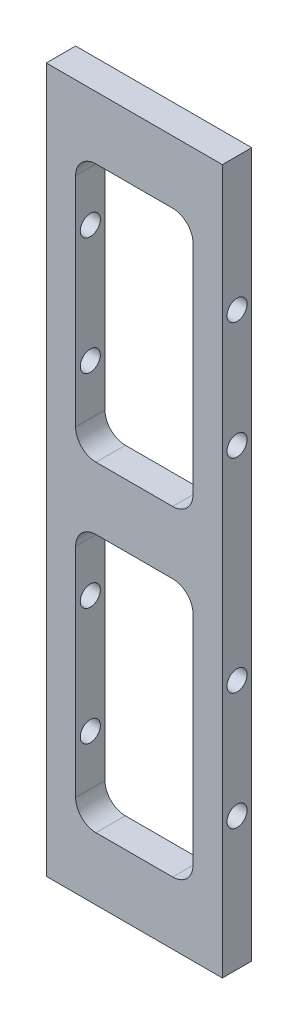
ISO-10303-21;
HEADER;
FILE_DESCRIPTION(('STEP AP214'),'2;1');
FILE_NAME('part.step','',(''),(''),'','','');
FILE_SCHEMA(('AUTOMOTIVE_DESIGN { 1 0 10303 214 1 1 1 1 }'));
ENDSEC;
DATA;
#1=APPLICATION_CONTEXT('core data for automotive mechanical design processes');
#2=APPLICATION_PROTOCOL_DEFINITION('international standard','automotive_design',2000,#1);
#3=PRODUCT_CONTEXT('',#1,'mechanical');
#4=PRODUCT('Part','Part','',(#3));
#5=PRODUCT_RELATED_PRODUCT_CATEGORY('part','',(#4));
#6=PRODUCT_DEFINITION_FORMATION('','',#4);
#7=PRODUCT_DEFINITION_CONTEXT('part definition',#1,'design');
#8=PRODUCT_DEFINITION('design','',#6,#7);
#9=PRODUCT_DEFINITION_SHAPE('','',#8);
#10=(LENGTH_UNIT() NAMED_UNIT(*) SI_UNIT(.MILLI.,.METRE.));
#11=(NAMED_UNIT(*) PLANE_ANGLE_UNIT() SI_UNIT($,.RADIAN.));
#12=(NAMED_UNIT(*) SI_UNIT($,.STERADIAN.) SOLID_ANGLE_UNIT());
#13=UNCERTAINTY_MEASURE_WITH_UNIT(LENGTH_MEASURE(1.E-05),#10,'distance_accuracy_value','');
#14=(GEOMETRIC_REPRESENTATION_CONTEXT(3) GLOBAL_UNCERTAINTY_ASSIGNED_CONTEXT((#13)) GLOBAL_UNIT_ASSIGNED_CONTEXT((#10,
#11,#12)) REPRESENTATION_CONTEXT('',''));
#15=CARTESIAN_POINT('',(0.,0.,0.));
#16=DIRECTION('',(0.,0.,1.));
#17=DIRECTION('',(1.,0.,0.));
#18=AXIS2_PLACEMENT_3D('',#15,#16,#17);
#19=CARTESIAN_POINT('',(14.2875,-57.15,-4.7625));
#20=DIRECTION('',(-1.,0.,0.));
#21=DIRECTION('',(0.,0.,-1.));
#22=AXIS2_PLACEMENT_3D('',#19,#20,#21);
#23=PLANE('',#22);
#24=CARTESIAN_POINT('',(14.2875,35.56,-2.38125));
#25=DIRECTION('',(-1.,0.,0.));
#26=DIRECTION('',(0.,0.,1.));
#27=AXIS2_PLACEMENT_3D('',#24,#25,#26);
#28=CIRCLE('',#27,1.63194999999999);
#29=CARTESIAN_POINT('',(14.2875,35.56,-0.749300000000011));
#30=VERTEX_POINT('',#29);
#31=EDGE_CURVE('E620',#30,#30,#28,.T.);
#32=ORIENTED_EDGE('',*,*,#31,.T.);
#33=EDGE_LOOP('',(#32));
#34=FACE_BOUND('',#33,.T.);
#35=CARTESIAN_POINT('',(14.2875,16.51,-2.38125));
#36=DIRECTION('',(-1.,0.,0.));
#37=DIRECTION('',(0.,0.,1.));
#38=AXIS2_PLACEMENT_3D('',#35,#36,#37);
#39=CIRCLE('',#38,1.63194999999999);
#40=CARTESIAN_POINT('',(14.2875,16.51,-0.749300000000006));
#41=VERTEX_POINT('',#40);
#42=EDGE_CURVE('E315',#41,#41,#39,.T.);
#43=ORIENTED_EDGE('',*,*,#42,.T.);
#44=EDGE_LOOP('',(#43));
#45=FACE_BOUND('',#44,.T.);
#46=CARTESIAN_POINT('',(14.2875,-16.51,-2.38124999999999));
#47=DIRECTION('',(-1.,0.,0.));
#48=DIRECTION('',(0.,0.,1.));
#49=AXIS2_PLACEMENT_3D('',#46,#47,#48);
#50=CIRCLE('',#49,1.63194999999999);
#51=CARTESIAN_POINT('',(14.2875,-16.51,-0.749300000000003));
#52=VERTEX_POINT('',#51);
#53=EDGE_CURVE('E312',#52,#52,#50,.T.);
#54=ORIENTED_EDGE('',*,*,#53,.T.);
#55=EDGE_LOOP('',(#54));
#56=FACE_BOUND('',#55,.T.);
#57=CARTESIAN_POINT('',(14.2875,-35.56,-2.38124999999999));
#58=DIRECTION('',(-1.,0.,0.));
#59=DIRECTION('',(0.,0.,1.));
#60=AXIS2_PLACEMENT_3D('',#57,#58,#59);
#61=CIRCLE('',#60,1.63194999999999);
#62=CARTESIAN_POINT('',(14.2875,-35.56,-0.749300000000003));
#63=VERTEX_POINT('',#62);
#64=EDGE_CURVE('E330',#63,#63,#61,.T.);
#65=ORIENTED_EDGE('',*,*,#64,.T.);
#66=EDGE_LOOP('',(#65));
#67=FACE_BOUND('',#66,.T.);
#68=DIRECTION('',(0.,1.,0.));
#69=VECTOR('',#68,1.);
#70=CARTESIAN_POINT('',(14.2875,-57.15,0.));
#71=LINE('',#70,#69);
#72=CARTESIAN_POINT('',(14.2875,-57.15,0.));
#73=VERTEX_POINT('',#72);
#74=CARTESIAN_POINT('',(14.2875,57.15,0.));
#75=VERTEX_POINT('',#74);
#76=EDGE_CURVE('E214',#73,#75,#71,.T.);
#77=ORIENTED_EDGE('',*,*,#76,.F.);
#78=DIRECTION('',(0.,0.,1.));
#79=VECTOR('',#78,1.);
#80=CARTESIAN_POINT('',(14.2875,-57.15,-4.7625));
#81=LINE('',#80,#79);
#82=CARTESIAN_POINT('',(14.2875,-57.15,-4.7625));
#83=VERTEX_POINT('',#82);
#84=EDGE_CURVE('E202',#83,#73,#81,.T.);
#85=ORIENTED_EDGE('',*,*,#84,.F.);
#86=DIRECTION('',(0.,1.,0.));
#87=VECTOR('',#86,1.);
#88=CARTESIAN_POINT('',(14.2875,-57.15,-4.7625));
#89=LINE('',#88,#87);
#90=CARTESIAN_POINT('',(14.2875,57.15,-4.7625));
#91=VERTEX_POINT('',#90);
#92=EDGE_CURVE('E182',#83,#91,#89,.T.);
#93=ORIENTED_EDGE('',*,*,#92,.T.);
#94=DIRECTION('',(0.,0.,1.));
#95=VECTOR('',#94,1.);
#96=CARTESIAN_POINT('',(14.2875,57.15,-4.7625));
#97=LINE('',#96,#95);
#98=EDGE_CURVE('E191',#91,#75,#97,.T.);
#99=ORIENTED_EDGE('',*,*,#98,.T.);
#100=EDGE_LOOP('',(#77,#85,#93,#99));
#101=FACE_BOUND('',#100,.T.);
#102=ADVANCED_FACE('F39',(#34,#45,#56,#67,#101),#23,.F.);
#103=CARTESIAN_POINT('',(-14.2875,57.15,-4.7625));
#104=DIRECTION('',(0.,-1.,0.));
#105=DIRECTION('',(0.,0.,1.));
#106=AXIS2_PLACEMENT_3D('',#103,#104,#105);
#107=PLANE('',#106);
#108=DIRECTION('',(-1.,0.,0.));
#109=VECTOR('',#108,1.);
#110=CARTESIAN_POINT('',(-14.2875,57.15,0.));
#111=LINE('',#110,#109);
#112=CARTESIAN_POINT('',(-14.2875,57.15,0.));
#113=VERTEX_POINT('',#112);
#114=EDGE_CURVE('E194',#75,#113,#111,.T.);
#115=ORIENTED_EDGE('',*,*,#114,.F.);
#116=ORIENTED_EDGE('',*,*,#98,.F.);
#117=DIRECTION('',(-1.,0.,0.));
#118=VECTOR('',#117,1.);
#119=CARTESIAN_POINT('',(-14.2875,57.15,-4.7625));
#120=LINE('',#119,#118);
#121=CARTESIAN_POINT('',(-14.2875,57.15,-4.7625));
#122=VERTEX_POINT('',#121);
#123=EDGE_CURVE('E178',#91,#122,#120,.T.);
#124=ORIENTED_EDGE('',*,*,#123,.T.);
#125=DIRECTION('',(0.,0.,1.));
#126=VECTOR('',#125,1.);
#127=CARTESIAN_POINT('',(-14.2875,57.15,-4.7625));
#128=LINE('',#127,#126);
#129=EDGE_CURVE('E199',#122,#113,#128,.T.);
#130=ORIENTED_EDGE('',*,*,#129,.T.);
#131=EDGE_LOOP('',(#115,#116,#124,#130));
#132=FACE_BOUND('',#131,.T.);
#133=ADVANCED_FACE('F192',(#132),#107,.F.);
#134=CARTESIAN_POINT('',(-14.2875,-57.15,-4.7625));
#135=DIRECTION('',(1.,0.,0.));
#136=DIRECTION('',(0.,0.,1.));
#137=AXIS2_PLACEMENT_3D('',#134,#135,#136);
#138=PLANE('',#137);
#139=CARTESIAN_POINT('',(-14.2875,35.56,-2.38125));
#140=DIRECTION('',(-1.,0.,0.));
#141=DIRECTION('',(0.,0.,1.));
#142=AXIS2_PLACEMENT_3D('',#139,#140,#141);
#143=CIRCLE('',#142,1.63194999999999);
#144=CARTESIAN_POINT('',(-14.2875,35.56,-0.749300000000004));
#145=VERTEX_POINT('',#144);
#146=EDGE_CURVE('E590',#145,#145,#143,.T.);
#147=ORIENTED_EDGE('',*,*,#146,.F.);
#148=EDGE_LOOP('',(#147));
#149=FACE_BOUND('',#148,.T.);
#150=CARTESIAN_POINT('',(-14.2875,16.51,-2.38125));
#151=DIRECTION('',(-1.,0.,0.));
#152=DIRECTION('',(0.,0.,1.));
#153=AXIS2_PLACEMENT_3D('',#150,#151,#152);
#154=CIRCLE('',#153,1.63194999999999);
#155=CARTESIAN_POINT('',(-14.2875,16.51,-0.749300000000002));
#156=VERTEX_POINT('',#155);
#157=EDGE_CURVE('E308',#156,#156,#154,.T.);
#158=ORIENTED_EDGE('',*,*,#157,.F.);
#159=EDGE_LOOP('',(#158));
#160=FACE_BOUND('',#159,.T.);
#161=CARTESIAN_POINT('',(-14.2875,-16.51,-2.38124999999999));
#162=DIRECTION('',(-1.,0.,0.));
#163=DIRECTION('',(0.,0.,1.));
#164=AXIS2_PLACEMENT_3D('',#161,#162,#163);
#165=CIRCLE('',#164,1.63194999999999);
#166=CARTESIAN_POINT('',(-14.2875,-16.51,-0.749299999999998));
#167=VERTEX_POINT('',#166);
#168=EDGE_CURVE('E304',#167,#167,#165,.T.);
#169=ORIENTED_EDGE('',*,*,#168,.F.);
#170=EDGE_LOOP('',(#169));
#171=FACE_BOUND('',#170,.T.);
#172=CARTESIAN_POINT('',(-14.2875,-35.56,-2.38124999999999));
#173=DIRECTION('',(-1.,0.,0.));
#174=DIRECTION('',(0.,0.,1.));
#175=AXIS2_PLACEMENT_3D('',#172,#173,#174);
#176=CIRCLE('',#175,1.63194999999999);
#177=CARTESIAN_POINT('',(-14.2875,-35.56,-0.749299999999996));
#178=VERTEX_POINT('',#177);
#179=EDGE_CURVE('E300',#178,#178,#176,.T.);
#180=ORIENTED_EDGE('',*,*,#179,.F.);
#181=EDGE_LOOP('',(#180));
#182=FACE_BOUND('',#181,.T.);
#183=DIRECTION('',(0.,-1.,0.));
#184=VECTOR('',#183,1.);
#185=CARTESIAN_POINT('',(-14.2875,-57.15,0.));
#186=LINE('',#185,#184);
#187=CARTESIAN_POINT('',(-14.2875,-57.15,0.));
#188=VERTEX_POINT('',#187);
#189=EDGE_CURVE('E205',#113,#188,#186,.T.);
#190=ORIENTED_EDGE('',*,*,#189,.F.);
#191=ORIENTED_EDGE('',*,*,#129,.F.);
#192=DIRECTION('',(0.,-1.,0.));
#193=VECTOR('',#192,1.);
#194=CARTESIAN_POINT('',(-14.2875,-57.15,-4.7625));
#195=LINE('',#194,#193);
#196=CARTESIAN_POINT('',(-14.2875,-57.15,-4.7625));
#197=VERTEX_POINT('',#196);
#198=EDGE_CURVE('E185',#122,#197,#195,.T.);
#199=ORIENTED_EDGE('',*,*,#198,.T.);
#200=DIRECTION('',(0.,0.,1.));
#201=VECTOR('',#200,1.);
#202=CARTESIAN_POINT('',(-14.2875,-57.15,-4.7625));
#203=LINE('',#202,#201);
#204=EDGE_CURVE('E221',#197,#188,#203,.T.);
#205=ORIENTED_EDGE('',*,*,#204,.T.);
#206=EDGE_LOOP('',(#190,#191,#199,#205));
#207=FACE_BOUND('',#206,.T.);
#208=ADVANCED_FACE('F424',(#149,#160,#171,#182,#207),#138,.F.);
#209=CARTESIAN_POINT('',(-14.2875,-57.15,-4.7625));
#210=DIRECTION('',(0.,1.,0.));
#211=DIRECTION('',(0.,0.,-1.));
#212=AXIS2_PLACEMENT_3D('',#209,#210,#211);
#213=PLANE('',#212);
#214=DIRECTION('',(1.,0.,0.));
#215=VECTOR('',#214,1.);
#216=CARTESIAN_POINT('',(-14.2875,-57.15,0.));
#217=LINE('',#216,#215);
#218=EDGE_CURVE('E203',#188,#73,#217,.T.);
#219=ORIENTED_EDGE('',*,*,#218,.F.);
#220=ORIENTED_EDGE('',*,*,#204,.F.);
#221=DIRECTION('',(1.,0.,0.));
#222=VECTOR('',#221,1.);
#223=CARTESIAN_POINT('',(-14.2875,-57.15,-4.7625));
#224=LINE('',#223,#222);
#225=EDGE_CURVE('E212',#197,#83,#224,.T.);
#226=ORIENTED_EDGE('',*,*,#225,.T.);
#227=ORIENTED_EDGE('',*,*,#84,.T.);
#228=EDGE_LOOP('',(#219,#220,#226,#227));
#229=FACE_BOUND('',#228,.T.);
#230=ADVANCED_FACE('F576',(#229),#213,.F.);
#231=CARTESIAN_POINT('',(0.,0.,-4.7625));
#232=DIRECTION('',(0.,0.,1.));
#233=DIRECTION('',(-1.,0.,0.));
#234=AXIS2_PLACEMENT_3D('',#231,#232,#233);
#235=PLANE('',#234);
#236=DIRECTION('',(1.,0.,0.));
#237=VECTOR('',#236,1.);
#238=CARTESIAN_POINT('',(-9.52500000000001,-46.99,-4.7625));
#239=LINE('',#238,#237);
#240=CARTESIAN_POINT('',(-6.22300000000001,-46.99,-4.7625));
#241=VERTEX_POINT('',#240);
#242=CARTESIAN_POINT('',(6.223,-46.99,-4.7625));
#243=VERTEX_POINT('',#242);
#244=EDGE_CURVE('E354',#241,#243,#239,.T.);
#245=ORIENTED_EDGE('',*,*,#244,.T.);
#246=CARTESIAN_POINT('',(6.223,-43.688,-4.7625));
#247=DIRECTION('',(0.,0.,-1.));
#248=DIRECTION('',(-1.,0.,0.));
#249=AXIS2_PLACEMENT_3D('',#246,#247,#248);
#250=CIRCLE('',#249,3.302);
#251=CARTESIAN_POINT('',(9.525,-43.688,-4.7625));
#252=VERTEX_POINT('',#251);
#253=EDGE_CURVE('E260',#252,#243,#250,.T.);
#254=ORIENTED_EDGE('',*,*,#253,.F.);
#255=DIRECTION('',(0.,1.,0.));
#256=VECTOR('',#255,1.);
#257=CARTESIAN_POINT('',(9.52500000000001,-5.08,-4.7625));
#258=LINE('',#257,#256);
#259=CARTESIAN_POINT('',(9.52500000000001,-8.382,-4.7625));
#260=VERTEX_POINT('',#259);
#261=EDGE_CURVE('E357',#252,#260,#258,.T.);
#262=ORIENTED_EDGE('',*,*,#261,.T.);
#263=CARTESIAN_POINT('',(6.223,-8.382,-4.7625));
#264=DIRECTION('',(0.,0.,-1.));
#265=DIRECTION('',(-1.,0.,0.));
#266=AXIS2_PLACEMENT_3D('',#263,#264,#265);
#267=CIRCLE('',#266,3.302);
#268=CARTESIAN_POINT('',(6.223,-5.08,-4.7625));
#269=VERTEX_POINT('',#268);
#270=EDGE_CURVE('E272',#269,#260,#267,.T.);
#271=ORIENTED_EDGE('',*,*,#270,.F.);
#272=DIRECTION('',(-1.,0.,0.));
#273=VECTOR('',#272,1.);
#274=CARTESIAN_POINT('',(-9.52500000000001,-5.08,-4.7625));
#275=LINE('',#274,#273);
#276=CARTESIAN_POINT('',(-6.22300000000001,-5.08,-4.7625));
#277=VERTEX_POINT('',#276);
#278=EDGE_CURVE('E342',#269,#277,#275,.T.);
#279=ORIENTED_EDGE('',*,*,#278,.T.);
#280=CARTESIAN_POINT('',(-6.22300000000001,-8.382,-4.7625));
#281=DIRECTION('',(0.,0.,-1.));
#282=DIRECTION('',(-1.,0.,0.));
#283=AXIS2_PLACEMENT_3D('',#280,#281,#282);
#284=CIRCLE('',#283,3.302);
#285=CARTESIAN_POINT('',(-9.52500000000001,-8.382,-4.7625));
#286=VERTEX_POINT('',#285);
#287=EDGE_CURVE('E266',#286,#277,#284,.T.);
#288=ORIENTED_EDGE('',*,*,#287,.F.);
#289=DIRECTION('',(0.,-1.,0.));
#290=VECTOR('',#289,1.);
#291=CARTESIAN_POINT('',(-9.52500000000001,-5.08,-4.7625));
#292=LINE('',#291,#290);
#293=CARTESIAN_POINT('',(-9.52500000000001,-43.688,-4.7625));
#294=VERTEX_POINT('',#293);
#295=EDGE_CURVE('E337',#286,#294,#292,.T.);
#296=ORIENTED_EDGE('',*,*,#295,.T.);
#297=CARTESIAN_POINT('',(-6.22300000000001,-43.688,-4.7625));
#298=DIRECTION('',(0.,0.,-1.));
#299=DIRECTION('',(-1.,0.,0.));
#300=AXIS2_PLACEMENT_3D('',#297,#298,#299);
#301=CIRCLE('',#300,3.302);
#302=EDGE_CURVE('E254',#241,#294,#301,.T.);
#303=ORIENTED_EDGE('',*,*,#302,.F.);
#304=EDGE_LOOP('',(#245,#254,#262,#271,#279,#288,#296,#303));
#305=FACE_BOUND('',#304,.T.);
#306=DIRECTION('',(-1.,0.,0.));
#307=VECTOR('',#306,1.);
#308=CARTESIAN_POINT('',(-9.52500000000001,46.99,-4.7625));
#309=LINE('',#308,#307);
#310=CARTESIAN_POINT('',(6.223,46.99,-4.7625));
#311=VERTEX_POINT('',#310);
#312=CARTESIAN_POINT('',(-6.22300000000001,46.99,-4.7625));
#313=VERTEX_POINT('',#312);
#314=EDGE_CURVE('E374',#311,#313,#309,.T.);
#315=ORIENTED_EDGE('',*,*,#314,.T.);
#316=CARTESIAN_POINT('',(-6.22300000000001,43.688,-4.7625));
#317=DIRECTION('',(0.,0.,-1.));
#318=DIRECTION('',(-1.,0.,0.));
#319=AXIS2_PLACEMENT_3D('',#316,#317,#318);
#320=CIRCLE('',#319,3.302);
#321=CARTESIAN_POINT('',(-9.52500000000001,43.688,-4.7625));
#322=VERTEX_POINT('',#321);
#323=EDGE_CURVE('E48',#322,#313,#320,.T.);
#324=ORIENTED_EDGE('',*,*,#323,.F.);
#325=DIRECTION('',(0.,-1.,0.));
#326=VECTOR('',#325,1.);
#327=CARTESIAN_POINT('',(-9.52500000000001,5.08,-4.7625));
#328=LINE('',#327,#326);
#329=CARTESIAN_POINT('',(-9.52500000000001,8.382,-4.7625));
#330=VERTEX_POINT('',#329);
#331=EDGE_CURVE('E376',#322,#330,#328,.T.);
#332=ORIENTED_EDGE('',*,*,#331,.T.);
#333=CARTESIAN_POINT('',(-6.22300000000001,8.382,-4.7625));
#334=DIRECTION('',(0.,0.,-1.));
#335=DIRECTION('',(-1.,0.,0.));
#336=AXIS2_PLACEMENT_3D('',#333,#334,#335);
#337=CIRCLE('',#336,3.302);
#338=CARTESIAN_POINT('',(-6.22300000000001,5.08,-4.7625));
#339=VERTEX_POINT('',#338);
#340=EDGE_CURVE('E278',#339,#330,#337,.T.);
#341=ORIENTED_EDGE('',*,*,#340,.F.);
#342=DIRECTION('',(1.,0.,0.));
#343=VECTOR('',#342,1.);
#344=CARTESIAN_POINT('',(-9.52500000000001,5.08,-4.7625));
#345=LINE('',#344,#343);
#346=CARTESIAN_POINT('',(6.22300000000001,5.08,-4.7625));
#347=VERTEX_POINT('',#346);
#348=EDGE_CURVE('E208',#339,#347,#345,.T.);
#349=ORIENTED_EDGE('',*,*,#348,.T.);
#350=CARTESIAN_POINT('',(6.22300000000001,8.382,-4.7625));
#351=DIRECTION('',(0.,0.,-1.));
#352=DIRECTION('',(-1.,0.,0.));
#353=AXIS2_PLACEMENT_3D('',#350,#351,#352);
#354=CIRCLE('',#353,3.302);
#355=CARTESIAN_POINT('',(9.52500000000001,8.382,-4.7625));
#356=VERTEX_POINT('',#355);
#357=EDGE_CURVE('E284',#356,#347,#354,.T.);
#358=ORIENTED_EDGE('',*,*,#357,.F.);
#359=DIRECTION('',(0.,1.,0.));
#360=VECTOR('',#359,1.);
#361=CARTESIAN_POINT('',(9.52500000000001,5.08,-4.7625));
#362=LINE('',#361,#360);
#363=CARTESIAN_POINT('',(9.525,43.688,-4.7625));
#364=VERTEX_POINT('',#363);
#365=EDGE_CURVE('E351',#356,#364,#362,.T.);
#366=ORIENTED_EDGE('',*,*,#365,.T.);
#367=CARTESIAN_POINT('',(6.223,43.688,-4.7625));
#368=DIRECTION('',(0.,0.,-1.));
#369=DIRECTION('',(-1.,0.,0.));
#370=AXIS2_PLACEMENT_3D('',#367,#368,#369);
#371=CIRCLE('',#370,3.302);
#372=EDGE_CURVE('E290',#311,#364,#371,.T.);
#373=ORIENTED_EDGE('',*,*,#372,.F.);
#374=EDGE_LOOP('',(#315,#324,#332,#341,#349,#358,#366,#373));
#375=FACE_BOUND('',#374,.T.);
#376=ORIENTED_EDGE('',*,*,#92,.F.);
#377=ORIENTED_EDGE('',*,*,#225,.F.);
#378=ORIENTED_EDGE('',*,*,#198,.F.);
#379=ORIENTED_EDGE('',*,*,#123,.F.);
#380=EDGE_LOOP('',(#376,#377,#378,#379));
#381=FACE_BOUND('',#380,.T.);
#382=ADVANCED_FACE('F180',(#305,#375,#381),#235,.F.);
#383=CARTESIAN_POINT('',(0.,0.,0.));
#384=DIRECTION('',(0.,0.,1.));
#385=DIRECTION('',(-1.,0.,0.));
#386=AXIS2_PLACEMENT_3D('',#383,#384,#385);
#387=PLANE('',#386);
#388=DIRECTION('',(-1.,0.,0.));
#389=VECTOR('',#388,1.);
#390=CARTESIAN_POINT('',(-9.52500000000001,-5.08,0.));
#391=LINE('',#390,#389);
#392=CARTESIAN_POINT('',(6.223,-5.08,0.));
#393=VERTEX_POINT('',#392);
#394=CARTESIAN_POINT('',(-6.22300000000001,-5.08,0.));
#395=VERTEX_POINT('',#394);
#396=EDGE_CURVE('E348',#393,#395,#391,.T.);
#397=ORIENTED_EDGE('',*,*,#396,.F.);
#398=CARTESIAN_POINT('',(6.223,-8.382,0.));
#399=DIRECTION('',(0.,0.,-1.));
#400=DIRECTION('',(-1.,0.,0.));
#401=AXIS2_PLACEMENT_3D('',#398,#399,#400);
#402=CIRCLE('',#401,3.302);
#403=CARTESIAN_POINT('',(9.52500000000001,-8.382,0.));
#404=VERTEX_POINT('',#403);
#405=EDGE_CURVE('E275',#404,#393,#402,.F.);
#406=ORIENTED_EDGE('',*,*,#405,.F.);
#407=DIRECTION('',(0.,1.,0.));
#408=VECTOR('',#407,1.);
#409=CARTESIAN_POINT('',(9.52500000000001,-5.08,0.));
#410=LINE('',#409,#408);
#411=CARTESIAN_POINT('',(9.525,-43.688,0.));
#412=VERTEX_POINT('',#411);
#413=EDGE_CURVE('E345',#412,#404,#410,.T.);
#414=ORIENTED_EDGE('',*,*,#413,.F.);
#415=CARTESIAN_POINT('',(6.223,-43.688,0.));
#416=DIRECTION('',(0.,0.,-1.));
#417=DIRECTION('',(-1.,0.,0.));
#418=AXIS2_PLACEMENT_3D('',#415,#416,#417);
#419=CIRCLE('',#418,3.302);
#420=CARTESIAN_POINT('',(6.223,-46.99,0.));
#421=VERTEX_POINT('',#420);
#422=EDGE_CURVE('E263',#421,#412,#419,.F.);
#423=ORIENTED_EDGE('',*,*,#422,.F.);
#424=DIRECTION('',(1.,0.,0.));
#425=VECTOR('',#424,1.);
#426=CARTESIAN_POINT('',(-9.52500000000001,-46.99,0.));
#427=LINE('',#426,#425);
#428=CARTESIAN_POINT('',(-6.22300000000001,-46.99,0.));
#429=VERTEX_POINT('',#428);
#430=EDGE_CURVE('E341',#429,#421,#427,.T.);
#431=ORIENTED_EDGE('',*,*,#430,.F.);
#432=CARTESIAN_POINT('',(-6.22300000000001,-43.688,0.));
#433=DIRECTION('',(0.,0.,-1.));
#434=DIRECTION('',(-1.,0.,0.));
#435=AXIS2_PLACEMENT_3D('',#432,#433,#434);
#436=CIRCLE('',#435,3.302);
#437=CARTESIAN_POINT('',(-9.52500000000001,-43.688,0.));
#438=VERTEX_POINT('',#437);
#439=EDGE_CURVE('E257',#438,#429,#436,.F.);
#440=ORIENTED_EDGE('',*,*,#439,.F.);
#441=DIRECTION('',(0.,-1.,0.));
#442=VECTOR('',#441,1.);
#443=CARTESIAN_POINT('',(-9.52500000000001,-5.08,0.));
#444=LINE('',#443,#442);
#445=CARTESIAN_POINT('',(-9.52500000000001,-8.382,0.));
#446=VERTEX_POINT('',#445);
#447=EDGE_CURVE('E338',#446,#438,#444,.T.);
#448=ORIENTED_EDGE('',*,*,#447,.F.);
#449=CARTESIAN_POINT('',(-6.22300000000001,-8.382,0.));
#450=DIRECTION('',(0.,0.,-1.));
#451=DIRECTION('',(-1.,0.,0.));
#452=AXIS2_PLACEMENT_3D('',#449,#450,#451);
#453=CIRCLE('',#452,3.302);
#454=EDGE_CURVE('E269',#395,#446,#453,.F.);
#455=ORIENTED_EDGE('',*,*,#454,.F.);
#456=EDGE_LOOP('',(#397,#406,#414,#423,#431,#440,#448,#455));
#457=FACE_BOUND('',#456,.T.);
#458=DIRECTION('',(1.,0.,0.));
#459=VECTOR('',#458,1.);
#460=CARTESIAN_POINT('',(-9.52500000000001,5.08,0.));
#461=LINE('',#460,#459);
#462=CARTESIAN_POINT('',(-6.22300000000001,5.08,0.));
#463=VERTEX_POINT('',#462);
#464=CARTESIAN_POINT('',(6.22300000000001,5.08,0.));
#465=VERTEX_POINT('',#464);
#466=EDGE_CURVE('E216',#463,#465,#461,.T.);
#467=ORIENTED_EDGE('',*,*,#466,.F.);
#468=CARTESIAN_POINT('',(-6.22300000000001,8.382,0.));
#469=DIRECTION('',(0.,0.,-1.));
#470=DIRECTION('',(-1.,0.,0.));
#471=AXIS2_PLACEMENT_3D('',#468,#469,#470);
#472=CIRCLE('',#471,3.302);
#473=CARTESIAN_POINT('',(-9.52500000000001,8.382,0.));
#474=VERTEX_POINT('',#473);
#475=EDGE_CURVE('E281',#474,#463,#472,.F.);
#476=ORIENTED_EDGE('',*,*,#475,.F.);
#477=DIRECTION('',(0.,-1.,0.));
#478=VECTOR('',#477,1.);
#479=CARTESIAN_POINT('',(-9.52500000000001,5.08,0.));
#480=LINE('',#479,#478);
#481=CARTESIAN_POINT('',(-9.52500000000001,43.688,0.));
#482=VERTEX_POINT('',#481);
#483=EDGE_CURVE('E367',#482,#474,#480,.T.);
#484=ORIENTED_EDGE('',*,*,#483,.F.);
#485=CARTESIAN_POINT('',(-6.22300000000001,43.688,0.));
#486=DIRECTION('',(0.,0.,-1.));
#487=DIRECTION('',(-1.,0.,0.));
#488=AXIS2_PLACEMENT_3D('',#485,#486,#487);
#489=CIRCLE('',#488,3.302);
#490=CARTESIAN_POINT('',(-6.22300000000001,46.99,0.));
#491=VERTEX_POINT('',#490);
#492=EDGE_CURVE('E11',#491,#482,#489,.F.);
#493=ORIENTED_EDGE('',*,*,#492,.F.);
#494=DIRECTION('',(-1.,0.,0.));
#495=VECTOR('',#494,1.);
#496=CARTESIAN_POINT('',(-9.52500000000001,46.99,0.));
#497=LINE('',#496,#495);
#498=CARTESIAN_POINT('',(6.223,46.99,0.));
#499=VERTEX_POINT('',#498);
#500=EDGE_CURVE('E365',#499,#491,#497,.T.);
#501=ORIENTED_EDGE('',*,*,#500,.F.);
#502=CARTESIAN_POINT('',(6.223,43.688,0.));
#503=DIRECTION('',(0.,0.,-1.));
#504=DIRECTION('',(-1.,0.,0.));
#505=AXIS2_PLACEMENT_3D('',#502,#503,#504);
#506=CIRCLE('',#505,3.302);
#507=CARTESIAN_POINT('',(9.525,43.688,0.));
#508=VERTEX_POINT('',#507);
#509=EDGE_CURVE('E293',#508,#499,#506,.F.);
#510=ORIENTED_EDGE('',*,*,#509,.F.);
#511=DIRECTION('',(0.,1.,0.));
#512=VECTOR('',#511,1.);
#513=CARTESIAN_POINT('',(9.52500000000001,5.08,0.));
#514=LINE('',#513,#512);
#515=CARTESIAN_POINT('',(9.52500000000001,8.382,0.));
#516=VERTEX_POINT('',#515);
#517=EDGE_CURVE('E362',#516,#508,#514,.T.);
#518=ORIENTED_EDGE('',*,*,#517,.F.);
#519=CARTESIAN_POINT('',(6.22300000000001,8.382,0.));
#520=DIRECTION('',(0.,0.,-1.));
#521=DIRECTION('',(-1.,0.,0.));
#522=AXIS2_PLACEMENT_3D('',#519,#520,#521);
#523=CIRCLE('',#522,3.302);
#524=EDGE_CURVE('E287',#465,#516,#523,.F.);
#525=ORIENTED_EDGE('',*,*,#524,.F.);
#526=EDGE_LOOP('',(#467,#476,#484,#493,#501,#510,#518,#525));
#527=FACE_BOUND('',#526,.T.);
#528=ORIENTED_EDGE('',*,*,#76,.T.);
#529=ORIENTED_EDGE('',*,*,#114,.T.);
#530=ORIENTED_EDGE('',*,*,#189,.T.);
#531=ORIENTED_EDGE('',*,*,#218,.T.);
#532=EDGE_LOOP('',(#528,#529,#530,#531));
#533=FACE_BOUND('',#532,.T.);
#534=ADVANCED_FACE('F407',(#457,#527,#533),#387,.T.);
#535=CARTESIAN_POINT('',(9.52500000000001,5.08,0.));
#536=DIRECTION('',(1.,0.,0.));
#537=DIRECTION('',(0.,1.,0.));
#538=AXIS2_PLACEMENT_3D('',#535,#536,#537);
#539=PLANE('',#538);
#540=CARTESIAN_POINT('',(9.525,35.56,-2.38125));
#541=DIRECTION('',(-1.,0.,0.));
#542=DIRECTION('',(0.,1.,0.));
#543=AXIS2_PLACEMENT_3D('',#540,#541,#542);
#544=CIRCLE('',#543,1.63194999999999);
#545=CARTESIAN_POINT('',(9.525,37.19195,-2.38125));
#546=VERTEX_POINT('',#545);
#547=EDGE_CURVE('E320',#546,#546,#544,.T.);
#548=ORIENTED_EDGE('',*,*,#547,.F.);
#549=EDGE_LOOP('',(#548));
#550=FACE_BOUND('',#549,.T.);
#551=CARTESIAN_POINT('',(9.52500000000001,16.51,-2.38125));
#552=DIRECTION('',(-1.,0.,0.));
#553=DIRECTION('',(0.,1.,0.));
#554=AXIS2_PLACEMENT_3D('',#551,#552,#553);
#555=CIRCLE('',#554,1.63194999999999);
#556=CARTESIAN_POINT('',(9.52500000000001,18.14195,-2.38125));
#557=VERTEX_POINT('',#556);
#558=EDGE_CURVE('E307',#557,#557,#555,.T.);
#559=ORIENTED_EDGE('',*,*,#558,.F.);
#560=EDGE_LOOP('',(#559));
#561=FACE_BOUND('',#560,.T.);
#562=ORIENTED_EDGE('',*,*,#517,.T.);
#563=DIRECTION('',(0.,0.,-1.));
#564=VECTOR('',#563,1.);
#565=CARTESIAN_POINT('',(9.525,43.688,0.));
#566=LINE('',#565,#564);
#567=EDGE_CURVE('E248',#364,#508,#566,.F.);
#568=ORIENTED_EDGE('',*,*,#567,.F.);
#569=ORIENTED_EDGE('',*,*,#365,.F.);
#570=DIRECTION('',(0.,0.,-1.));
#571=VECTOR('',#570,1.);
#572=CARTESIAN_POINT('',(9.52500000000001,8.382,-4.7625));
#573=LINE('',#572,#571);
#574=EDGE_CURVE('E250',#516,#356,#573,.T.);
#575=ORIENTED_EDGE('',*,*,#574,.F.);
#576=EDGE_LOOP('',(#562,#568,#569,#575));
#577=FACE_BOUND('',#576,.T.);
#578=ADVANCED_FACE('F394',(#550,#561,#577),#539,.F.);
#579=CARTESIAN_POINT('',(-9.52500000000001,5.08,0.));
#580=DIRECTION('',(0.,-1.,0.));
#581=DIRECTION('',(0.,0.,1.));
#582=AXIS2_PLACEMENT_3D('',#579,#580,#581);
#583=PLANE('',#582);
#584=ORIENTED_EDGE('',*,*,#466,.T.);
#585=DIRECTION('',(0.,0.,-1.));
#586=VECTOR('',#585,1.);
#587=CARTESIAN_POINT('',(6.22300000000001,5.08,0.));
#588=LINE('',#587,#586);
#589=EDGE_CURVE('E240',#347,#465,#588,.F.);
#590=ORIENTED_EDGE('',*,*,#589,.F.);
#591=ORIENTED_EDGE('',*,*,#348,.F.);
#592=DIRECTION('',(0.,0.,-1.));
#593=VECTOR('',#592,1.);
#594=CARTESIAN_POINT('',(-6.22300000000001,5.08,-4.7625));
#595=LINE('',#594,#593);
#596=EDGE_CURVE('E242',#463,#339,#595,.T.);
#597=ORIENTED_EDGE('',*,*,#596,.F.);
#598=EDGE_LOOP('',(#584,#590,#591,#597));
#599=FACE_BOUND('',#598,.T.);
#600=ADVANCED_FACE('F386',(#599),#583,.F.);
#601=CARTESIAN_POINT('',(-9.52500000000001,5.08,0.));
#602=DIRECTION('',(-1.,0.,0.));
#603=DIRECTION('',(0.,-1.,0.));
#604=AXIS2_PLACEMENT_3D('',#601,#602,#603);
#605=PLANE('',#604);
#606=CARTESIAN_POINT('',(-9.52500000000001,35.56,-2.38125));
#607=DIRECTION('',(1.,0.,0.));
#608=DIRECTION('',(0.,-1.,0.));
#609=AXIS2_PLACEMENT_3D('',#606,#607,#608);
#610=CIRCLE('',#609,1.63194999999999);
#611=CARTESIAN_POINT('',(-9.52500000000001,33.92805,-2.38125));
#612=VERTEX_POINT('',#611);
#613=EDGE_CURVE('E43',#612,#612,#610,.T.);
#614=ORIENTED_EDGE('',*,*,#613,.F.);
#615=EDGE_LOOP('',(#614));
#616=FACE_BOUND('',#615,.T.);
#617=CARTESIAN_POINT('',(-9.52500000000001,16.51,-2.38125));
#618=DIRECTION('',(1.,0.,0.));
#619=DIRECTION('',(0.,-1.,0.));
#620=AXIS2_PLACEMENT_3D('',#617,#618,#619);
#621=CIRCLE('',#620,1.63194999999999);
#622=CARTESIAN_POINT('',(-9.52500000000001,14.87805,-2.38125));
#623=VERTEX_POINT('',#622);
#624=EDGE_CURVE('E305',#623,#623,#621,.T.);
#625=ORIENTED_EDGE('',*,*,#624,.F.);
#626=EDGE_LOOP('',(#625));
#627=FACE_BOUND('',#626,.T.);
#628=ORIENTED_EDGE('',*,*,#331,.F.);
#629=DIRECTION('',(0.,0.,-1.));
#630=VECTOR('',#629,1.);
#631=CARTESIAN_POINT('',(-9.52500000000001,43.688,-4.7625));
#632=LINE('',#631,#630);
#633=EDGE_CURVE('E244',#482,#322,#632,.T.);
#634=ORIENTED_EDGE('',*,*,#633,.F.);
#635=ORIENTED_EDGE('',*,*,#483,.T.);
#636=DIRECTION('',(0.,0.,-1.));
#637=VECTOR('',#636,1.);
#638=CARTESIAN_POINT('',(-9.52500000000001,8.382,0.));
#639=LINE('',#638,#637);
#640=EDGE_CURVE('E246',#330,#474,#639,.F.);
#641=ORIENTED_EDGE('',*,*,#640,.F.);
#642=EDGE_LOOP('',(#628,#634,#635,#641));
#643=FACE_BOUND('',#642,.T.);
#644=ADVANCED_FACE('F402',(#616,#627,#643),#605,.F.);
#645=CARTESIAN_POINT('',(-9.52500000000001,46.99,0.));
#646=DIRECTION('',(0.,1.,0.));
#647=DIRECTION('',(0.,0.,-1.));
#648=AXIS2_PLACEMENT_3D('',#645,#646,#647);
#649=PLANE('',#648);
#650=ORIENTED_EDGE('',*,*,#500,.T.);
#651=DIRECTION('',(0.,0.,-1.));
#652=VECTOR('',#651,1.);
#653=CARTESIAN_POINT('',(-6.22300000000001,46.99,0.));
#654=LINE('',#653,#652);
#655=EDGE_CURVE('E55',#313,#491,#654,.F.);
#656=ORIENTED_EDGE('',*,*,#655,.F.);
#657=ORIENTED_EDGE('',*,*,#314,.F.);
#658=DIRECTION('',(0.,0.,-1.));
#659=VECTOR('',#658,1.);
#660=CARTESIAN_POINT('',(6.223,46.99,-4.7625));
#661=LINE('',#660,#659);
#662=EDGE_CURVE('E62',#499,#311,#661,.T.);
#663=ORIENTED_EDGE('',*,*,#662,.F.);
#664=EDGE_LOOP('',(#650,#656,#657,#663));
#665=FACE_BOUND('',#664,.T.);
#666=ADVANCED_FACE('F397',(#665),#649,.F.);
#667=CARTESIAN_POINT('',(-9.52500000000001,-5.08,0.));
#668=DIRECTION('',(-1.,0.,0.));
#669=DIRECTION('',(0.,-1.,0.));
#670=AXIS2_PLACEMENT_3D('',#667,#668,#669);
#671=PLANE('',#670);
#672=CARTESIAN_POINT('',(-9.52500000000001,-16.51,-2.38124999999999));
#673=DIRECTION('',(1.,0.,0.));
#674=DIRECTION('',(0.,-1.,0.));
#675=AXIS2_PLACEMENT_3D('',#672,#673,#674);
#676=CIRCLE('',#675,1.63194999999999);
#677=CARTESIAN_POINT('',(-9.52500000000001,-18.14195,-2.38124999999999));
#678=VERTEX_POINT('',#677);
#679=EDGE_CURVE('E303',#678,#678,#676,.T.);
#680=ORIENTED_EDGE('',*,*,#679,.F.);
#681=EDGE_LOOP('',(#680));
#682=FACE_BOUND('',#681,.T.);
#683=CARTESIAN_POINT('',(-9.52500000000001,-35.56,-2.38124999999999));
#684=DIRECTION('',(1.,0.,0.));
#685=DIRECTION('',(0.,-1.,0.));
#686=AXIS2_PLACEMENT_3D('',#683,#684,#685);
#687=CIRCLE('',#686,1.63194999999999);
#688=CARTESIAN_POINT('',(-9.52500000000001,-37.19195,-2.38124999999999));
#689=VERTEX_POINT('',#688);
#690=EDGE_CURVE('E299',#689,#689,#687,.T.);
#691=ORIENTED_EDGE('',*,*,#690,.F.);
#692=EDGE_LOOP('',(#691));
#693=FACE_BOUND('',#692,.T.);
#694=ORIENTED_EDGE('',*,*,#295,.F.);
#695=DIRECTION('',(0.,0.,-1.));
#696=VECTOR('',#695,1.);
#697=CARTESIAN_POINT('',(-9.52500000000001,-8.382,-4.7625));
#698=LINE('',#697,#696);
#699=EDGE_CURVE('E228',#446,#286,#698,.T.);
#700=ORIENTED_EDGE('',*,*,#699,.F.);
#701=ORIENTED_EDGE('',*,*,#447,.T.);
#702=DIRECTION('',(0.,0.,-1.));
#703=VECTOR('',#702,1.);
#704=CARTESIAN_POINT('',(-9.52500000000001,-43.688,0.));
#705=LINE('',#704,#703);
#706=EDGE_CURVE('E230',#294,#438,#705,.F.);
#707=ORIENTED_EDGE('',*,*,#706,.F.);
#708=EDGE_LOOP('',(#694,#700,#701,#707));
#709=FACE_BOUND('',#708,.T.);
#710=ADVANCED_FACE('F553',(#682,#693,#709),#671,.F.);
#711=CARTESIAN_POINT('',(-9.52500000000001,-5.08,0.));
#712=DIRECTION('',(0.,1.,0.));
#713=DIRECTION('',(0.,0.,-1.));
#714=AXIS2_PLACEMENT_3D('',#711,#712,#713);
#715=PLANE('',#714);
#716=ORIENTED_EDGE('',*,*,#278,.F.);
#717=DIRECTION('',(0.,0.,-1.));
#718=VECTOR('',#717,1.);
#719=CARTESIAN_POINT('',(6.223,-5.08,-4.7625));
#720=LINE('',#719,#718);
#721=EDGE_CURVE('E236',#393,#269,#720,.T.);
#722=ORIENTED_EDGE('',*,*,#721,.F.);
#723=ORIENTED_EDGE('',*,*,#396,.T.);
#724=DIRECTION('',(0.,0.,-1.));
#725=VECTOR('',#724,1.);
#726=CARTESIAN_POINT('',(-6.22300000000001,-5.08,0.));
#727=LINE('',#726,#725);
#728=EDGE_CURVE('E238',#277,#395,#727,.F.);
#729=ORIENTED_EDGE('',*,*,#728,.F.);
#730=EDGE_LOOP('',(#716,#722,#723,#729));
#731=FACE_BOUND('',#730,.T.);
#732=ADVANCED_FACE('F549',(#731),#715,.F.);
#733=CARTESIAN_POINT('',(9.52500000000001,-5.08,0.));
#734=DIRECTION('',(1.,0.,0.));
#735=DIRECTION('',(0.,1.,0.));
#736=AXIS2_PLACEMENT_3D('',#733,#734,#735);
#737=PLANE('',#736);
#738=CARTESIAN_POINT('',(9.52500000000001,-16.51,-2.38124999999999));
#739=DIRECTION('',(-1.,0.,0.));
#740=DIRECTION('',(0.,1.,0.));
#741=AXIS2_PLACEMENT_3D('',#738,#739,#740);
#742=CIRCLE('',#741,1.63194999999999);
#743=CARTESIAN_POINT('',(9.52500000000001,-14.87805,-2.38124999999999));
#744=VERTEX_POINT('',#743);
#745=EDGE_CURVE('E301',#744,#744,#742,.T.);
#746=ORIENTED_EDGE('',*,*,#745,.F.);
#747=EDGE_LOOP('',(#746));
#748=FACE_BOUND('',#747,.T.);
#749=CARTESIAN_POINT('',(9.525,-35.56,-2.38124999999999));
#750=DIRECTION('',(-1.,0.,0.));
#751=DIRECTION('',(0.,1.,0.));
#752=AXIS2_PLACEMENT_3D('',#749,#750,#751);
#753=CIRCLE('',#752,1.63194999999999);
#754=CARTESIAN_POINT('',(9.525,-33.92805,-2.38124999999999));
#755=VERTEX_POINT('',#754);
#756=EDGE_CURVE('E296',#755,#755,#753,.T.);
#757=ORIENTED_EDGE('',*,*,#756,.F.);
#758=EDGE_LOOP('',(#757));
#759=FACE_BOUND('',#758,.T.);
#760=ORIENTED_EDGE('',*,*,#413,.T.);
#761=DIRECTION('',(0.,0.,-1.));
#762=VECTOR('',#761,1.);
#763=CARTESIAN_POINT('',(9.52500000000001,-8.382,0.));
#764=LINE('',#763,#762);
#765=EDGE_CURVE('E232',#260,#404,#764,.F.);
#766=ORIENTED_EDGE('',*,*,#765,.F.);
#767=ORIENTED_EDGE('',*,*,#261,.F.);
#768=DIRECTION('',(0.,0.,-1.));
#769=VECTOR('',#768,1.);
#770=CARTESIAN_POINT('',(9.525,-43.688,-4.7625));
#771=LINE('',#770,#769);
#772=EDGE_CURVE('E234',#412,#252,#771,.T.);
#773=ORIENTED_EDGE('',*,*,#772,.F.);
#774=EDGE_LOOP('',(#760,#766,#767,#773));
#775=FACE_BOUND('',#774,.T.);
#776=ADVANCED_FACE('F552',(#748,#759,#775),#737,.F.);
#777=CARTESIAN_POINT('',(-9.52500000000001,-46.99,0.));
#778=DIRECTION('',(0.,-1.,0.));
#779=DIRECTION('',(0.,0.,1.));
#780=AXIS2_PLACEMENT_3D('',#777,#778,#779);
#781=PLANE('',#780);
#782=ORIENTED_EDGE('',*,*,#430,.T.);
#783=DIRECTION('',(0.,0.,-1.));
#784=VECTOR('',#783,1.);
#785=CARTESIAN_POINT('',(6.223,-46.99,0.));
#786=LINE('',#785,#784);
#787=EDGE_CURVE('E198',#243,#421,#786,.F.);
#788=ORIENTED_EDGE('',*,*,#787,.F.);
#789=ORIENTED_EDGE('',*,*,#244,.F.);
#790=DIRECTION('',(0.,0.,-1.));
#791=VECTOR('',#790,1.);
#792=CARTESIAN_POINT('',(-6.22300000000001,-46.99,-4.7625));
#793=LINE('',#792,#791);
#794=EDGE_CURVE('E226',#429,#241,#793,.T.);
#795=ORIENTED_EDGE('',*,*,#794,.F.);
#796=EDGE_LOOP('',(#782,#788,#789,#795));
#797=FACE_BOUND('',#796,.T.);
#798=ADVANCED_FACE('F434',(#797),#781,.F.);
#799=CARTESIAN_POINT('',(-6.22300000000001,-43.688,0.));
#800=DIRECTION('',(0.,0.,1.));
#801=DIRECTION('',(-1.,0.,0.));
#802=AXIS2_PLACEMENT_3D('',#799,#800,#801);
#803=CYLINDRICAL_SURFACE('',#802,3.302);
#804=ORIENTED_EDGE('',*,*,#439,.T.);
#805=ORIENTED_EDGE('',*,*,#794,.T.);
#806=ORIENTED_EDGE('',*,*,#302,.T.);
#807=ORIENTED_EDGE('',*,*,#706,.T.);
#808=EDGE_LOOP('',(#804,#805,#806,#807));
#809=FACE_BOUND('',#808,.T.);
#810=ADVANCED_FACE('F430',(#809),#803,.F.);
#811=CARTESIAN_POINT('',(6.223,-43.688,0.));
#812=DIRECTION('',(0.,0.,1.));
#813=DIRECTION('',(-1.,0.,0.));
#814=AXIS2_PLACEMENT_3D('',#811,#812,#813);
#815=CYLINDRICAL_SURFACE('',#814,3.302);
#816=ORIENTED_EDGE('',*,*,#422,.T.);
#817=ORIENTED_EDGE('',*,*,#772,.T.);
#818=ORIENTED_EDGE('',*,*,#253,.T.);
#819=ORIENTED_EDGE('',*,*,#787,.T.);
#820=EDGE_LOOP('',(#816,#817,#818,#819));
#821=FACE_BOUND('',#820,.T.);
#822=ADVANCED_FACE('F433',(#821),#815,.F.);
#823=CARTESIAN_POINT('',(-6.22300000000001,-8.382,0.));
#824=DIRECTION('',(0.,0.,1.));
#825=DIRECTION('',(-1.,0.,0.));
#826=AXIS2_PLACEMENT_3D('',#823,#824,#825);
#827=CYLINDRICAL_SURFACE('',#826,3.302);
#828=ORIENTED_EDGE('',*,*,#454,.T.);
#829=ORIENTED_EDGE('',*,*,#699,.T.);
#830=ORIENTED_EDGE('',*,*,#287,.T.);
#831=ORIENTED_EDGE('',*,*,#728,.T.);
#832=EDGE_LOOP('',(#828,#829,#830,#831));
#833=FACE_BOUND('',#832,.T.);
#834=ADVANCED_FACE('F438',(#833),#827,.F.);
#835=CARTESIAN_POINT('',(6.223,-8.382,0.));
#836=DIRECTION('',(0.,0.,1.));
#837=DIRECTION('',(-1.,0.,0.));
#838=AXIS2_PLACEMENT_3D('',#835,#836,#837);
#839=CYLINDRICAL_SURFACE('',#838,3.302);
#840=ORIENTED_EDGE('',*,*,#405,.T.);
#841=ORIENTED_EDGE('',*,*,#721,.T.);
#842=ORIENTED_EDGE('',*,*,#270,.T.);
#843=ORIENTED_EDGE('',*,*,#765,.T.);
#844=EDGE_LOOP('',(#840,#841,#842,#843));
#845=FACE_BOUND('',#844,.T.);
#846=ADVANCED_FACE('F442',(#845),#839,.F.);
#847=CARTESIAN_POINT('',(-6.22300000000001,8.382,0.));
#848=DIRECTION('',(0.,0.,1.));
#849=DIRECTION('',(-1.,0.,0.));
#850=AXIS2_PLACEMENT_3D('',#847,#848,#849);
#851=CYLINDRICAL_SURFACE('',#850,3.302);
#852=ORIENTED_EDGE('',*,*,#475,.T.);
#853=ORIENTED_EDGE('',*,*,#596,.T.);
#854=ORIENTED_EDGE('',*,*,#340,.T.);
#855=ORIENTED_EDGE('',*,*,#640,.T.);
#856=EDGE_LOOP('',(#852,#853,#854,#855));
#857=FACE_BOUND('',#856,.T.);
#858=ADVANCED_FACE('F405',(#857),#851,.F.);
#859=CARTESIAN_POINT('',(6.22300000000001,8.382,0.));
#860=DIRECTION('',(0.,0.,1.));
#861=DIRECTION('',(-1.,0.,0.));
#862=AXIS2_PLACEMENT_3D('',#859,#860,#861);
#863=CYLINDRICAL_SURFACE('',#862,3.302);
#864=ORIENTED_EDGE('',*,*,#524,.T.);
#865=ORIENTED_EDGE('',*,*,#574,.T.);
#866=ORIENTED_EDGE('',*,*,#357,.T.);
#867=ORIENTED_EDGE('',*,*,#589,.T.);
#868=EDGE_LOOP('',(#864,#865,#866,#867));
#869=FACE_BOUND('',#868,.T.);
#870=ADVANCED_FACE('F390',(#869),#863,.F.);
#871=CARTESIAN_POINT('',(6.223,43.688,0.));
#872=DIRECTION('',(0.,0.,1.));
#873=DIRECTION('',(-1.,0.,0.));
#874=AXIS2_PLACEMENT_3D('',#871,#872,#873);
#875=CYLINDRICAL_SURFACE('',#874,3.302);
#876=ORIENTED_EDGE('',*,*,#509,.T.);
#877=ORIENTED_EDGE('',*,*,#662,.T.);
#878=ORIENTED_EDGE('',*,*,#372,.T.);
#879=ORIENTED_EDGE('',*,*,#567,.T.);
#880=EDGE_LOOP('',(#876,#877,#878,#879));
#881=FACE_BOUND('',#880,.T.);
#882=ADVANCED_FACE('F410',(#881),#875,.F.);
#883=CARTESIAN_POINT('',(-6.22300000000001,43.688,0.));
#884=DIRECTION('',(0.,0.,1.));
#885=DIRECTION('',(-1.,0.,0.));
#886=AXIS2_PLACEMENT_3D('',#883,#884,#885);
#887=CYLINDRICAL_SURFACE('',#886,3.302);
#888=ORIENTED_EDGE('',*,*,#492,.T.);
#889=ORIENTED_EDGE('',*,*,#633,.T.);
#890=ORIENTED_EDGE('',*,*,#323,.T.);
#891=ORIENTED_EDGE('',*,*,#655,.T.);
#892=EDGE_LOOP('',(#888,#889,#890,#891));
#893=FACE_BOUND('',#892,.T.);
#894=ADVANCED_FACE('F41',(#893),#887,.F.);
#895=CARTESIAN_POINT('',(14.2875,-35.56,-2.38124999999999));
#896=DIRECTION('',(1.,0.,0.));
#897=DIRECTION('',(0.,0.,1.));
#898=AXIS2_PLACEMENT_3D('',#895,#896,#897);
#899=CYLINDRICAL_SURFACE('',#898,1.63194999999999);
#900=ORIENTED_EDGE('',*,*,#64,.F.);
#901=EDGE_LOOP('',(#900));
#902=FACE_BOUND('',#901,.T.);
#903=ORIENTED_EDGE('',*,*,#756,.T.);
#904=EDGE_LOOP('',(#903));
#905=FACE_BOUND('',#904,.T.);
#906=ADVANCED_FACE('F416',(#902,#905),#899,.F.);
#907=ORIENTED_EDGE('',*,*,#179,.T.);
#908=EDGE_LOOP('',(#907));
#909=FACE_BOUND('',#908,.T.);
#910=ORIENTED_EDGE('',*,*,#690,.T.);
#911=EDGE_LOOP('',(#910));
#912=FACE_BOUND('',#911,.T.);
#913=ADVANCED_FACE('F475',(#909,#912),#899,.F.);
#914=CARTESIAN_POINT('',(14.2875,-16.51,-2.38124999999999));
#915=DIRECTION('',(1.,0.,0.));
#916=DIRECTION('',(0.,0.,1.));
#917=AXIS2_PLACEMENT_3D('',#914,#915,#916);
#918=CYLINDRICAL_SURFACE('',#917,1.63194999999999);
#919=ORIENTED_EDGE('',*,*,#53,.F.);
#920=EDGE_LOOP('',(#919));
#921=FACE_BOUND('',#920,.T.);
#922=ORIENTED_EDGE('',*,*,#745,.T.);
#923=EDGE_LOOP('',(#922));
#924=FACE_BOUND('',#923,.T.);
#925=ADVANCED_FACE('F485',(#921,#924),#918,.F.);
#926=ORIENTED_EDGE('',*,*,#168,.T.);
#927=EDGE_LOOP('',(#926));
#928=FACE_BOUND('',#927,.T.);
#929=ORIENTED_EDGE('',*,*,#679,.T.);
#930=EDGE_LOOP('',(#929));
#931=FACE_BOUND('',#930,.T.);
#932=ADVANCED_FACE('F494',(#928,#931),#918,.F.);
#933=CARTESIAN_POINT('',(14.2875,16.51,-2.38125));
#934=DIRECTION('',(1.,0.,0.));
#935=DIRECTION('',(0.,0.,1.));
#936=AXIS2_PLACEMENT_3D('',#933,#934,#935);
#937=CYLINDRICAL_SURFACE('',#936,1.63194999999999);
#938=ORIENTED_EDGE('',*,*,#157,.T.);
#939=EDGE_LOOP('',(#938));
#940=FACE_BOUND('',#939,.T.);
#941=ORIENTED_EDGE('',*,*,#624,.T.);
#942=EDGE_LOOP('',(#941));
#943=FACE_BOUND('',#942,.T.);
#944=ADVANCED_FACE('F504',(#940,#943),#937,.F.);
#945=ORIENTED_EDGE('',*,*,#42,.F.);
#946=EDGE_LOOP('',(#945));
#947=FACE_BOUND('',#946,.T.);
#948=ORIENTED_EDGE('',*,*,#558,.T.);
#949=EDGE_LOOP('',(#948));
#950=FACE_BOUND('',#949,.T.);
#951=ADVANCED_FACE('F513',(#947,#950),#937,.F.);
#952=CARTESIAN_POINT('',(14.2875,35.56,-2.38125));
#953=DIRECTION('',(1.,0.,0.));
#954=DIRECTION('',(0.,0.,1.));
#955=AXIS2_PLACEMENT_3D('',#952,#953,#954);
#956=CYLINDRICAL_SURFACE('',#955,1.63194999999999);
#957=ORIENTED_EDGE('',*,*,#146,.T.);
#958=EDGE_LOOP('',(#957));
#959=FACE_BOUND('',#958,.T.);
#960=ORIENTED_EDGE('',*,*,#613,.T.);
#961=EDGE_LOOP('',(#960));
#962=FACE_BOUND('',#961,.T.);
#963=ADVANCED_FACE('F522',(#959,#962),#956,.F.);
#964=ORIENTED_EDGE('',*,*,#31,.F.);
#965=EDGE_LOOP('',(#964));
#966=FACE_BOUND('',#965,.T.);
#967=ORIENTED_EDGE('',*,*,#547,.T.);
#968=EDGE_LOOP('',(#967));
#969=FACE_BOUND('',#968,.T.);
#970=ADVANCED_FACE('F532',(#966,#969),#956,.F.);
#971=CLOSED_SHELL('',(#102,#133,#208,#230,#382,#534,#578,#600,#644,#666,#710,#732,#776,#798,
#810,#822,#834,#846,#858,#870,#882,#894,#906,#913,#925,#932,#944,#951,#963,#970));
#972=MANIFOLD_SOLID_BREP('B2',#971);
#973=ADVANCED_BREP_SHAPE_REPRESENTATION('',(#18,#972),#14);
#974=SHAPE_DEFINITION_REPRESENTATION(#9,#973);
ENDSEC;
END-ISO-10303-21;
